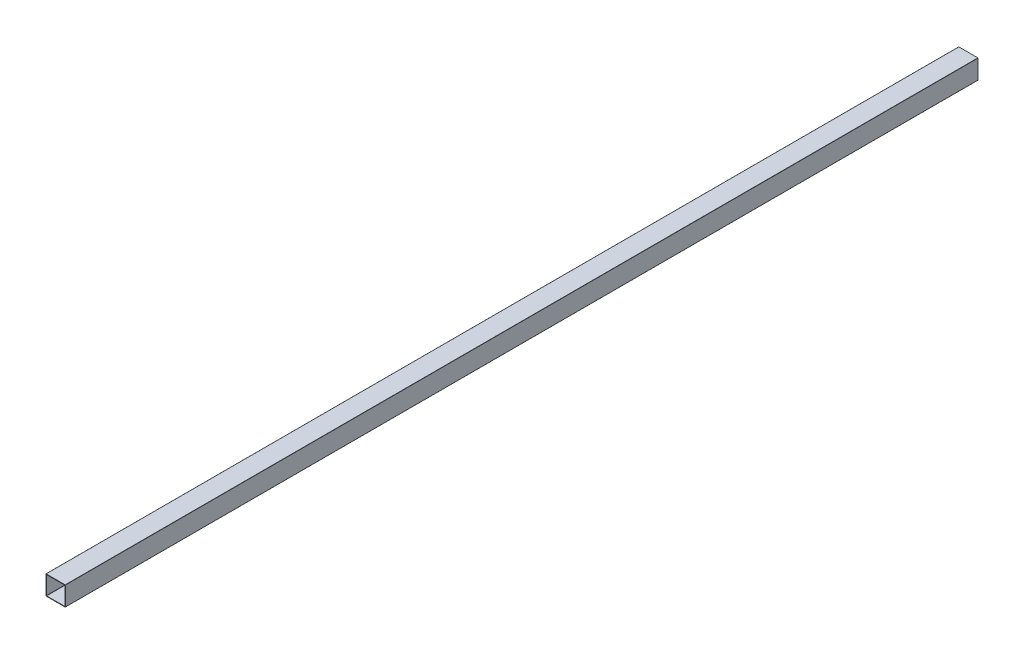
ISO-10303-21;
HEADER;
FILE_DESCRIPTION(('STEP AP214'),'2;1');
FILE_NAME('part.step','',(''),(''),'','','');
FILE_SCHEMA(('AUTOMOTIVE_DESIGN { 1 0 10303 214 1 1 1 1 }'));
ENDSEC;
DATA;
#1=APPLICATION_CONTEXT('core data for automotive mechanical design processes');
#2=APPLICATION_PROTOCOL_DEFINITION('international standard','automotive_design',2000,#1);
#3=PRODUCT_CONTEXT('',#1,'mechanical');
#4=PRODUCT('Part','Part','',(#3));
#5=PRODUCT_RELATED_PRODUCT_CATEGORY('part','',(#4));
#6=PRODUCT_DEFINITION_FORMATION('','',#4);
#7=PRODUCT_DEFINITION_CONTEXT('part definition',#1,'design');
#8=PRODUCT_DEFINITION('design','',#6,#7);
#9=PRODUCT_DEFINITION_SHAPE('','',#8);
#10=(LENGTH_UNIT() NAMED_UNIT(*) SI_UNIT(.MILLI.,.METRE.));
#11=(NAMED_UNIT(*) PLANE_ANGLE_UNIT() SI_UNIT($,.RADIAN.));
#12=(NAMED_UNIT(*) SI_UNIT($,.STERADIAN.) SOLID_ANGLE_UNIT());
#13=UNCERTAINTY_MEASURE_WITH_UNIT(LENGTH_MEASURE(1.E-05),#10,'distance_accuracy_value','');
#14=(GEOMETRIC_REPRESENTATION_CONTEXT(3) GLOBAL_UNCERTAINTY_ASSIGNED_CONTEXT((#13)) GLOBAL_UNIT_ASSIGNED_CONTEXT((#10,
#11,#12)) REPRESENTATION_CONTEXT('',''));
#15=CARTESIAN_POINT('',(0.,0.,0.));
#16=DIRECTION('',(0.,0.,1.));
#17=DIRECTION('',(1.,0.,0.));
#18=AXIS2_PLACEMENT_3D('',#15,#16,#17);
#19=CARTESIAN_POINT('',(63.5,-63.5,-6000.));
#20=DIRECTION('',(1.,0.,0.));
#21=DIRECTION('',(0.,0.,-1.));
#22=AXIS2_PLACEMENT_3D('',#19,#20,#21);
#23=PLANE('',#22);
#24=DIRECTION('',(0.,1.,0.));
#25=VECTOR('',#24,1.);
#26=CARTESIAN_POINT('',(63.5,-63.5,0.));
#27=LINE('',#26,#25);
#28=CARTESIAN_POINT('',(63.5,-62.5,0.));
#29=VERTEX_POINT('',#28);
#30=CARTESIAN_POINT('',(63.5,62.5,0.));
#31=VERTEX_POINT('',#30);
#32=EDGE_CURVE('E197',#29,#31,#27,.T.);
#33=ORIENTED_EDGE('',*,*,#32,.F.);
#34=DIRECTION('',(0.,0.,1.));
#35=VECTOR('',#34,1.);
#36=CARTESIAN_POINT('',(63.5,-62.5,-6000.));
#37=LINE('',#36,#35);
#38=CARTESIAN_POINT('',(63.5,-62.5,-6000.));
#39=VERTEX_POINT('',#38);
#40=EDGE_CURVE('E158',#29,#39,#37,.F.);
#41=ORIENTED_EDGE('',*,*,#40,.T.);
#42=DIRECTION('',(0.,1.,0.));
#43=VECTOR('',#42,1.);
#44=CARTESIAN_POINT('',(63.5,-63.5,-6000.));
#45=LINE('',#44,#43);
#46=CARTESIAN_POINT('',(63.5,62.5,-6000.));
#47=VERTEX_POINT('',#46);
#48=EDGE_CURVE('E185',#39,#47,#45,.T.);
#49=ORIENTED_EDGE('',*,*,#48,.T.);
#50=DIRECTION('',(0.,0.,1.));
#51=VECTOR('',#50,1.);
#52=CARTESIAN_POINT('',(63.5,62.5,-6000.));
#53=LINE('',#52,#51);
#54=EDGE_CURVE('E251',#47,#31,#53,.T.);
#55=ORIENTED_EDGE('',*,*,#54,.T.);
#56=EDGE_LOOP('',(#33,#41,#49,#55));
#57=FACE_BOUND('',#56,.T.);
#58=ADVANCED_FACE('F33',(#57),#23,.T.);
#59=CARTESIAN_POINT('',(-63.5,-63.5,-6000.));
#60=DIRECTION('',(0.,-1.,0.));
#61=DIRECTION('',(0.,0.,-1.));
#62=AXIS2_PLACEMENT_3D('',#59,#60,#61);
#63=PLANE('',#62);
#64=DIRECTION('',(1.,0.,0.));
#65=VECTOR('',#64,1.);
#66=CARTESIAN_POINT('',(-63.5,-63.5,0.));
#67=LINE('',#66,#65);
#68=CARTESIAN_POINT('',(-62.5,-63.5,0.));
#69=VERTEX_POINT('',#68);
#70=CARTESIAN_POINT('',(62.5,-63.5,0.));
#71=VERTEX_POINT('',#70);
#72=EDGE_CURVE('E189',#69,#71,#67,.T.);
#73=ORIENTED_EDGE('',*,*,#72,.F.);
#74=DIRECTION('',(0.,0.,1.));
#75=VECTOR('',#74,1.);
#76=CARTESIAN_POINT('',(-62.5,-63.5,-6000.));
#77=LINE('',#76,#75);
#78=CARTESIAN_POINT('',(-62.5,-63.5,-6000.));
#79=VERTEX_POINT('',#78);
#80=EDGE_CURVE('E238',#69,#79,#77,.F.);
#81=ORIENTED_EDGE('',*,*,#80,.T.);
#82=DIRECTION('',(1.,0.,0.));
#83=VECTOR('',#82,1.);
#84=CARTESIAN_POINT('',(-63.5,-63.5,-6000.));
#85=LINE('',#84,#83);
#86=CARTESIAN_POINT('',(62.5,-63.5,-6000.));
#87=VERTEX_POINT('',#86);
#88=EDGE_CURVE('E194',#79,#87,#85,.T.);
#89=ORIENTED_EDGE('',*,*,#88,.T.);
#90=DIRECTION('',(0.,0.,1.));
#91=VECTOR('',#90,1.);
#92=CARTESIAN_POINT('',(62.5,-63.5,-6000.));
#93=LINE('',#92,#91);
#94=EDGE_CURVE('E235',#87,#71,#93,.T.);
#95=ORIENTED_EDGE('',*,*,#94,.T.);
#96=EDGE_LOOP('',(#73,#81,#89,#95));
#97=FACE_BOUND('',#96,.T.);
#98=ADVANCED_FACE('F305',(#97),#63,.T.);
#99=CARTESIAN_POINT('',(-63.5,-63.5,-6000.));
#100=DIRECTION('',(-1.,0.,0.));
#101=DIRECTION('',(0.,0.,1.));
#102=AXIS2_PLACEMENT_3D('',#99,#100,#101);
#103=PLANE('',#102);
#104=DIRECTION('',(0.,-1.,0.));
#105=VECTOR('',#104,1.);
#106=CARTESIAN_POINT('',(-63.5,-63.5,-6000.));
#107=LINE('',#106,#105);
#108=CARTESIAN_POINT('',(-63.5,62.5,-6000.));
#109=VERTEX_POINT('',#108);
#110=CARTESIAN_POINT('',(-63.5,-62.5,-6000.));
#111=VERTEX_POINT('',#110);
#112=EDGE_CURVE('E191',#109,#111,#107,.T.);
#113=ORIENTED_EDGE('',*,*,#112,.T.);
#114=DIRECTION('',(0.,0.,1.));
#115=VECTOR('',#114,1.);
#116=CARTESIAN_POINT('',(-63.5,-62.5,-6000.));
#117=LINE('',#116,#115);
#118=CARTESIAN_POINT('',(-63.5,-62.5,0.));
#119=VERTEX_POINT('',#118);
#120=EDGE_CURVE('E224',#111,#119,#117,.T.);
#121=ORIENTED_EDGE('',*,*,#120,.T.);
#122=DIRECTION('',(0.,-1.,0.));
#123=VECTOR('',#122,1.);
#124=CARTESIAN_POINT('',(-63.5,-63.5,0.));
#125=LINE('',#124,#123);
#126=CARTESIAN_POINT('',(-63.5,62.5,0.));
#127=VERTEX_POINT('',#126);
#128=EDGE_CURVE('E203',#127,#119,#125,.T.);
#129=ORIENTED_EDGE('',*,*,#128,.F.);
#130=DIRECTION('',(0.,0.,1.));
#131=VECTOR('',#130,1.);
#132=CARTESIAN_POINT('',(-63.5,62.5,-6000.));
#133=LINE('',#132,#131);
#134=EDGE_CURVE('E222',#127,#109,#133,.F.);
#135=ORIENTED_EDGE('',*,*,#134,.T.);
#136=EDGE_LOOP('',(#113,#121,#129,#135));
#137=FACE_BOUND('',#136,.T.);
#138=ADVANCED_FACE('F311',(#137),#103,.T.);
#139=CARTESIAN_POINT('',(-63.5,63.5,-6000.));
#140=DIRECTION('',(0.,1.,0.));
#141=DIRECTION('',(0.,0.,1.));
#142=AXIS2_PLACEMENT_3D('',#139,#140,#141);
#143=PLANE('',#142);
#144=DIRECTION('',(-1.,0.,0.));
#145=VECTOR('',#144,1.);
#146=CARTESIAN_POINT('',(-63.5,63.5,-6000.));
#147=LINE('',#146,#145);
#148=CARTESIAN_POINT('',(62.5,63.5,-6000.));
#149=VERTEX_POINT('',#148);
#150=CARTESIAN_POINT('',(-62.5,63.5,-6000.));
#151=VERTEX_POINT('',#150);
#152=EDGE_CURVE('E188',#149,#151,#147,.T.);
#153=ORIENTED_EDGE('',*,*,#152,.T.);
#154=DIRECTION('',(0.,0.,1.));
#155=VECTOR('',#154,1.);
#156=CARTESIAN_POINT('',(-62.5,63.5,-6000.));
#157=LINE('',#156,#155);
#158=CARTESIAN_POINT('',(-62.5,63.5,0.));
#159=VERTEX_POINT('',#158);
#160=EDGE_CURVE('E248',#151,#159,#157,.T.);
#161=ORIENTED_EDGE('',*,*,#160,.T.);
#162=DIRECTION('',(-1.,0.,0.));
#163=VECTOR('',#162,1.);
#164=CARTESIAN_POINT('',(-63.5,63.5,0.));
#165=LINE('',#164,#163);
#166=CARTESIAN_POINT('',(62.5,63.5,0.));
#167=VERTEX_POINT('',#166);
#168=EDGE_CURVE('E200',#167,#159,#165,.T.);
#169=ORIENTED_EDGE('',*,*,#168,.F.);
#170=DIRECTION('',(0.,0.,1.));
#171=VECTOR('',#170,1.);
#172=CARTESIAN_POINT('',(62.5,63.5,-6000.));
#173=LINE('',#172,#171);
#174=EDGE_CURVE('E55',#167,#149,#173,.F.);
#175=ORIENTED_EDGE('',*,*,#174,.T.);
#176=EDGE_LOOP('',(#153,#161,#169,#175));
#177=FACE_BOUND('',#176,.T.);
#178=ADVANCED_FACE('F316',(#177),#143,.T.);
#179=CARTESIAN_POINT('',(0.,0.,-6000.));
#180=DIRECTION('',(0.,0.,-1.));
#181=DIRECTION('',(-1.,0.,0.));
#182=AXIS2_PLACEMENT_3D('',#179,#180,#181);
#183=PLANE('',#182);
#184=DIRECTION('',(0.,-1.,0.));
#185=VECTOR('',#184,1.);
#186=CARTESIAN_POINT('',(-60.46,-60.46,-6000.));
#187=LINE('',#186,#185);
#188=CARTESIAN_POINT('',(-60.46,59.46,-6000.));
#189=VERTEX_POINT('',#188);
#190=CARTESIAN_POINT('',(-60.46,-59.46,-6000.));
#191=VERTEX_POINT('',#190);
#192=EDGE_CURVE('E167',#189,#191,#187,.T.);
#193=ORIENTED_EDGE('',*,*,#192,.T.);
#194=CARTESIAN_POINT('',(-59.46,-59.46,-6000.));
#195=DIRECTION('',(0.,0.,-1.));
#196=DIRECTION('',(-1.,0.,0.));
#197=AXIS2_PLACEMENT_3D('',#194,#195,#196);
#198=CIRCLE('',#197,1.);
#199=CARTESIAN_POINT('',(-59.46,-60.46,-6000.));
#200=VERTEX_POINT('',#199);
#201=EDGE_CURVE('E11',#191,#200,#198,.F.);
#202=ORIENTED_EDGE('',*,*,#201,.T.);
#203=DIRECTION('',(1.,0.,0.));
#204=VECTOR('',#203,1.);
#205=CARTESIAN_POINT('',(-60.46,-60.46,-6000.));
#206=LINE('',#205,#204);
#207=CARTESIAN_POINT('',(59.46,-60.46,-6000.));
#208=VERTEX_POINT('',#207);
#209=EDGE_CURVE('E175',#200,#208,#206,.T.);
#210=ORIENTED_EDGE('',*,*,#209,.T.);
#211=CARTESIAN_POINT('',(59.46,-59.46,-6000.));
#212=DIRECTION('',(0.,0.,-1.));
#213=DIRECTION('',(-1.,0.,0.));
#214=AXIS2_PLACEMENT_3D('',#211,#212,#213);
#215=CIRCLE('',#214,1.);
#216=CARTESIAN_POINT('',(60.46,-59.46,-6000.));
#217=VERTEX_POINT('',#216);
#218=EDGE_CURVE('E262',#208,#217,#215,.F.);
#219=ORIENTED_EDGE('',*,*,#218,.T.);
#220=DIRECTION('',(0.,1.,0.));
#221=VECTOR('',#220,1.);
#222=CARTESIAN_POINT('',(60.46,-60.46,-6000.));
#223=LINE('',#222,#221);
#224=CARTESIAN_POINT('',(60.46,59.46,-6000.));
#225=VERTEX_POINT('',#224);
#226=EDGE_CURVE('E179',#217,#225,#223,.T.);
#227=ORIENTED_EDGE('',*,*,#226,.T.);
#228=CARTESIAN_POINT('',(59.46,59.46,-6000.));
#229=DIRECTION('',(0.,0.,-1.));
#230=DIRECTION('',(-1.,0.,0.));
#231=AXIS2_PLACEMENT_3D('',#228,#229,#230);
#232=CIRCLE('',#231,1.);
#233=CARTESIAN_POINT('',(59.46,60.46,-6000.));
#234=VERTEX_POINT('',#233);
#235=EDGE_CURVE('E258',#225,#234,#232,.F.);
#236=ORIENTED_EDGE('',*,*,#235,.T.);
#237=DIRECTION('',(-1.,0.,0.));
#238=VECTOR('',#237,1.);
#239=CARTESIAN_POINT('',(-60.46,60.46,-6000.));
#240=LINE('',#239,#238);
#241=CARTESIAN_POINT('',(-59.46,60.46,-6000.));
#242=VERTEX_POINT('',#241);
#243=EDGE_CURVE('E277',#234,#242,#240,.T.);
#244=ORIENTED_EDGE('',*,*,#243,.T.);
#245=CARTESIAN_POINT('',(-59.46,59.46,-6000.));
#246=DIRECTION('',(0.,0.,-1.));
#247=DIRECTION('',(-1.,0.,0.));
#248=AXIS2_PLACEMENT_3D('',#245,#246,#247);
#249=CIRCLE('',#248,1.);
#250=EDGE_CURVE('E157',#242,#189,#249,.F.);
#251=ORIENTED_EDGE('',*,*,#250,.T.);
#252=EDGE_LOOP('',(#193,#202,#210,#219,#227,#236,#244,#251));
#253=FACE_BOUND('',#252,.T.);
#254=ORIENTED_EDGE('',*,*,#88,.F.);
#255=CARTESIAN_POINT('',(-62.5,-62.5,-6000.));
#256=DIRECTION('',(0.,0.,-1.));
#257=DIRECTION('',(-1.,0.,0.));
#258=AXIS2_PLACEMENT_3D('',#255,#256,#257);
#259=CIRCLE('',#258,1.);
#260=EDGE_CURVE('E245',#79,#111,#259,.T.);
#261=ORIENTED_EDGE('',*,*,#260,.T.);
#262=ORIENTED_EDGE('',*,*,#112,.F.);
#263=CARTESIAN_POINT('',(-62.5,62.5,-6000.));
#264=DIRECTION('',(0.,0.,-1.));
#265=DIRECTION('',(-1.,0.,0.));
#266=AXIS2_PLACEMENT_3D('',#263,#264,#265);
#267=CIRCLE('',#266,1.);
#268=EDGE_CURVE('E48',#109,#151,#267,.T.);
#269=ORIENTED_EDGE('',*,*,#268,.T.);
#270=ORIENTED_EDGE('',*,*,#152,.F.);
#271=CARTESIAN_POINT('',(62.5,62.5,-6000.));
#272=DIRECTION('',(0.,0.,-1.));
#273=DIRECTION('',(-1.,0.,0.));
#274=AXIS2_PLACEMENT_3D('',#271,#272,#273);
#275=CIRCLE('',#274,1.);
#276=EDGE_CURVE('E240',#149,#47,#275,.T.);
#277=ORIENTED_EDGE('',*,*,#276,.T.);
#278=ORIENTED_EDGE('',*,*,#48,.F.);
#279=CARTESIAN_POINT('',(62.5,-62.5,-6000.));
#280=DIRECTION('',(0.,0.,-1.));
#281=DIRECTION('',(-1.,0.,0.));
#282=AXIS2_PLACEMENT_3D('',#279,#280,#281);
#283=CIRCLE('',#282,1.);
#284=EDGE_CURVE('E242',#39,#87,#283,.T.);
#285=ORIENTED_EDGE('',*,*,#284,.T.);
#286=EDGE_LOOP('',(#254,#261,#262,#269,#270,#277,#278,#285));
#287=FACE_BOUND('',#286,.T.);
#288=ADVANCED_FACE('F267',(#253,#287),#183,.T.);
#289=CARTESIAN_POINT('',(0.,0.,0.));
#290=DIRECTION('',(0.,0.,-1.));
#291=DIRECTION('',(-1.,0.,0.));
#292=AXIS2_PLACEMENT_3D('',#289,#290,#291);
#293=PLANE('',#292);
#294=DIRECTION('',(0.,1.,0.));
#295=VECTOR('',#294,1.);
#296=CARTESIAN_POINT('',(60.46,-60.46,0.));
#297=LINE('',#296,#295);
#298=CARTESIAN_POINT('',(60.46,-59.46,0.));
#299=VERTEX_POINT('',#298);
#300=CARTESIAN_POINT('',(60.46,59.46,0.));
#301=VERTEX_POINT('',#300);
#302=EDGE_CURVE('E181',#299,#301,#297,.T.);
#303=ORIENTED_EDGE('',*,*,#302,.F.);
#304=CARTESIAN_POINT('',(59.46,-59.46,0.));
#305=DIRECTION('',(0.,0.,-1.));
#306=DIRECTION('',(-1.,0.,0.));
#307=AXIS2_PLACEMENT_3D('',#304,#305,#306);
#308=CIRCLE('',#307,1.);
#309=CARTESIAN_POINT('',(59.46,-60.46,0.));
#310=VERTEX_POINT('',#309);
#311=EDGE_CURVE('E260',#299,#310,#308,.T.);
#312=ORIENTED_EDGE('',*,*,#311,.T.);
#313=DIRECTION('',(1.,0.,0.));
#314=VECTOR('',#313,1.);
#315=CARTESIAN_POINT('',(-60.46,-60.46,0.));
#316=LINE('',#315,#314);
#317=CARTESIAN_POINT('',(-59.46,-60.46,0.));
#318=VERTEX_POINT('',#317);
#319=EDGE_CURVE('E281',#318,#310,#316,.T.);
#320=ORIENTED_EDGE('',*,*,#319,.F.);
#321=CARTESIAN_POINT('',(-59.46,-59.46,0.));
#322=DIRECTION('',(0.,0.,-1.));
#323=DIRECTION('',(-1.,0.,0.));
#324=AXIS2_PLACEMENT_3D('',#321,#322,#323);
#325=CIRCLE('',#324,1.);
#326=CARTESIAN_POINT('',(-60.46,-59.46,0.));
#327=VERTEX_POINT('',#326);
#328=EDGE_CURVE('E41',#318,#327,#325,.T.);
#329=ORIENTED_EDGE('',*,*,#328,.T.);
#330=DIRECTION('',(0.,-1.,0.));
#331=VECTOR('',#330,1.);
#332=CARTESIAN_POINT('',(-60.46,-60.46,0.));
#333=LINE('',#332,#331);
#334=CARTESIAN_POINT('',(-60.46,59.46,0.));
#335=VERTEX_POINT('',#334);
#336=EDGE_CURVE('E164',#335,#327,#333,.T.);
#337=ORIENTED_EDGE('',*,*,#336,.F.);
#338=CARTESIAN_POINT('',(-59.46,59.46,0.));
#339=DIRECTION('',(0.,0.,-1.));
#340=DIRECTION('',(-1.,0.,0.));
#341=AXIS2_PLACEMENT_3D('',#338,#339,#340);
#342=CIRCLE('',#341,1.);
#343=CARTESIAN_POINT('',(-59.46,60.46,0.));
#344=VERTEX_POINT('',#343);
#345=EDGE_CURVE('E147',#335,#344,#342,.T.);
#346=ORIENTED_EDGE('',*,*,#345,.T.);
#347=DIRECTION('',(-1.,0.,0.));
#348=VECTOR('',#347,1.);
#349=CARTESIAN_POINT('',(-60.46,60.46,0.));
#350=LINE('',#349,#348);
#351=CARTESIAN_POINT('',(59.46,60.46,0.));
#352=VERTEX_POINT('',#351);
#353=EDGE_CURVE('E176',#352,#344,#350,.T.);
#354=ORIENTED_EDGE('',*,*,#353,.F.);
#355=CARTESIAN_POINT('',(59.46,59.46,0.));
#356=DIRECTION('',(0.,0.,-1.));
#357=DIRECTION('',(-1.,0.,0.));
#358=AXIS2_PLACEMENT_3D('',#355,#356,#357);
#359=CIRCLE('',#358,1.);
#360=EDGE_CURVE('E256',#352,#301,#359,.T.);
#361=ORIENTED_EDGE('',*,*,#360,.T.);
#362=EDGE_LOOP('',(#303,#312,#320,#329,#337,#346,#354,#361));
#363=FACE_BOUND('',#362,.T.);
#364=ORIENTED_EDGE('',*,*,#128,.T.);
#365=CARTESIAN_POINT('',(-62.5,-62.5,0.));
#366=DIRECTION('',(0.,0.,-1.));
#367=DIRECTION('',(-1.,0.,0.));
#368=AXIS2_PLACEMENT_3D('',#365,#366,#367);
#369=CIRCLE('',#368,1.);
#370=EDGE_CURVE('E233',#119,#69,#369,.F.);
#371=ORIENTED_EDGE('',*,*,#370,.T.);
#372=ORIENTED_EDGE('',*,*,#72,.T.);
#373=CARTESIAN_POINT('',(62.5,-62.5,0.));
#374=DIRECTION('',(0.,0.,-1.));
#375=DIRECTION('',(-1.,0.,0.));
#376=AXIS2_PLACEMENT_3D('',#373,#374,#375);
#377=CIRCLE('',#376,1.);
#378=EDGE_CURVE('E229',#71,#29,#377,.F.);
#379=ORIENTED_EDGE('',*,*,#378,.T.);
#380=ORIENTED_EDGE('',*,*,#32,.T.);
#381=CARTESIAN_POINT('',(62.5,62.5,0.));
#382=DIRECTION('',(0.,0.,-1.));
#383=DIRECTION('',(-1.,0.,0.));
#384=AXIS2_PLACEMENT_3D('',#381,#382,#383);
#385=CIRCLE('',#384,1.);
#386=EDGE_CURVE('E227',#31,#167,#385,.F.);
#387=ORIENTED_EDGE('',*,*,#386,.T.);
#388=ORIENTED_EDGE('',*,*,#168,.T.);
#389=CARTESIAN_POINT('',(-62.5,62.5,0.));
#390=DIRECTION('',(0.,0.,-1.));
#391=DIRECTION('',(-1.,0.,0.));
#392=AXIS2_PLACEMENT_3D('',#389,#390,#391);
#393=CIRCLE('',#392,1.);
#394=EDGE_CURVE('E231',#159,#127,#393,.F.);
#395=ORIENTED_EDGE('',*,*,#394,.T.);
#396=EDGE_LOOP('',(#364,#371,#372,#379,#380,#387,#388,#395));
#397=FACE_BOUND('',#396,.T.);
#398=ADVANCED_FACE('F172',(#363,#397),#293,.F.);
#399=CARTESIAN_POINT('',(-60.46,-60.46,-6000.));
#400=DIRECTION('',(0.,-1.,0.));
#401=DIRECTION('',(0.,0.,-1.));
#402=AXIS2_PLACEMENT_3D('',#399,#400,#401);
#403=PLANE('',#402);
#404=ORIENTED_EDGE('',*,*,#319,.T.);
#405=DIRECTION('',(0.,0.,1.));
#406=VECTOR('',#405,1.);
#407=CARTESIAN_POINT('',(59.46,-60.46,-6000.));
#408=LINE('',#407,#406);
#409=EDGE_CURVE('E220',#310,#208,#408,.F.);
#410=ORIENTED_EDGE('',*,*,#409,.T.);
#411=ORIENTED_EDGE('',*,*,#209,.F.);
#412=DIRECTION('',(0.,0.,1.));
#413=VECTOR('',#412,1.);
#414=CARTESIAN_POINT('',(-59.46,-60.46,0.));
#415=LINE('',#414,#413);
#416=EDGE_CURVE('E217',#200,#318,#415,.T.);
#417=ORIENTED_EDGE('',*,*,#416,.T.);
#418=EDGE_LOOP('',(#404,#410,#411,#417));
#419=FACE_BOUND('',#418,.T.);
#420=ADVANCED_FACE('F283',(#419),#403,.F.);
#421=CARTESIAN_POINT('',(-60.46,-60.46,-6000.));
#422=DIRECTION('',(-1.,0.,0.));
#423=DIRECTION('',(0.,0.,1.));
#424=AXIS2_PLACEMENT_3D('',#421,#422,#423);
#425=PLANE('',#424);
#426=ORIENTED_EDGE('',*,*,#192,.F.);
#427=DIRECTION('',(0.,0.,1.));
#428=VECTOR('',#427,1.);
#429=CARTESIAN_POINT('',(-60.46,59.46,0.));
#430=LINE('',#429,#428);
#431=EDGE_CURVE('E151',#189,#335,#430,.T.);
#432=ORIENTED_EDGE('',*,*,#431,.T.);
#433=ORIENTED_EDGE('',*,*,#336,.T.);
#434=DIRECTION('',(0.,0.,1.));
#435=VECTOR('',#434,1.);
#436=CARTESIAN_POINT('',(-60.46,-59.46,-6000.));
#437=LINE('',#436,#435);
#438=EDGE_CURVE('E169',#327,#191,#437,.F.);
#439=ORIENTED_EDGE('',*,*,#438,.T.);
#440=EDGE_LOOP('',(#426,#432,#433,#439));
#441=FACE_BOUND('',#440,.T.);
#442=ADVANCED_FACE('F163',(#441),#425,.F.);
#443=CARTESIAN_POINT('',(-60.46,60.46,-6000.));
#444=DIRECTION('',(0.,1.,0.));
#445=DIRECTION('',(0.,0.,1.));
#446=AXIS2_PLACEMENT_3D('',#443,#444,#445);
#447=PLANE('',#446);
#448=ORIENTED_EDGE('',*,*,#353,.T.);
#449=DIRECTION('',(0.,0.,1.));
#450=VECTOR('',#449,1.);
#451=CARTESIAN_POINT('',(-59.46,60.46,-6000.));
#452=LINE('',#451,#450);
#453=EDGE_CURVE('E152',#344,#242,#452,.F.);
#454=ORIENTED_EDGE('',*,*,#453,.T.);
#455=ORIENTED_EDGE('',*,*,#243,.F.);
#456=DIRECTION('',(0.,0.,1.));
#457=VECTOR('',#456,1.);
#458=CARTESIAN_POINT('',(59.46,60.46,0.));
#459=LINE('',#458,#457);
#460=EDGE_CURVE('E168',#234,#352,#459,.T.);
#461=ORIENTED_EDGE('',*,*,#460,.T.);
#462=EDGE_LOOP('',(#448,#454,#455,#461));
#463=FACE_BOUND('',#462,.T.);
#464=ADVANCED_FACE('F292',(#463),#447,.F.);
#465=CARTESIAN_POINT('',(60.46,-60.46,-6000.));
#466=DIRECTION('',(1.,0.,0.));
#467=DIRECTION('',(0.,0.,-1.));
#468=AXIS2_PLACEMENT_3D('',#465,#466,#467);
#469=PLANE('',#468);
#470=ORIENTED_EDGE('',*,*,#302,.T.);
#471=DIRECTION('',(0.,0.,1.));
#472=VECTOR('',#471,1.);
#473=CARTESIAN_POINT('',(60.46,59.46,-6000.));
#474=LINE('',#473,#472);
#475=EDGE_CURVE('E215',#301,#225,#474,.F.);
#476=ORIENTED_EDGE('',*,*,#475,.T.);
#477=ORIENTED_EDGE('',*,*,#226,.F.);
#478=DIRECTION('',(0.,0.,1.));
#479=VECTOR('',#478,1.);
#480=CARTESIAN_POINT('',(60.46,-59.46,0.));
#481=LINE('',#480,#479);
#482=EDGE_CURVE('E212',#217,#299,#481,.T.);
#483=ORIENTED_EDGE('',*,*,#482,.T.);
#484=EDGE_LOOP('',(#470,#476,#477,#483));
#485=FACE_BOUND('',#484,.T.);
#486=ADVANCED_FACE('F275',(#485),#469,.F.);
#487=CARTESIAN_POINT('',(-59.46,59.46,-6000.));
#488=DIRECTION('',(0.,0.,-1.));
#489=DIRECTION('',(-1.,0.,0.));
#490=AXIS2_PLACEMENT_3D('',#487,#488,#489);
#491=CYLINDRICAL_SURFACE('',#490,1.);
#492=ORIENTED_EDGE('',*,*,#250,.F.);
#493=ORIENTED_EDGE('',*,*,#453,.F.);
#494=ORIENTED_EDGE('',*,*,#345,.F.);
#495=ORIENTED_EDGE('',*,*,#431,.F.);
#496=EDGE_LOOP('',(#492,#493,#494,#495));
#497=FACE_BOUND('',#496,.T.);
#498=ADVANCED_FACE('F150',(#497),#491,.F.);
#499=CARTESIAN_POINT('',(59.46,59.46,-6000.));
#500=DIRECTION('',(0.,0.,-1.));
#501=DIRECTION('',(-1.,0.,0.));
#502=AXIS2_PLACEMENT_3D('',#499,#500,#501);
#503=CYLINDRICAL_SURFACE('',#502,1.);
#504=ORIENTED_EDGE('',*,*,#235,.F.);
#505=ORIENTED_EDGE('',*,*,#475,.F.);
#506=ORIENTED_EDGE('',*,*,#360,.F.);
#507=ORIENTED_EDGE('',*,*,#460,.F.);
#508=EDGE_LOOP('',(#504,#505,#506,#507));
#509=FACE_BOUND('',#508,.T.);
#510=ADVANCED_FACE('F294',(#509),#503,.F.);
#511=CARTESIAN_POINT('',(59.46,-59.46,-6000.));
#512=DIRECTION('',(0.,0.,-1.));
#513=DIRECTION('',(-1.,0.,0.));
#514=AXIS2_PLACEMENT_3D('',#511,#512,#513);
#515=CYLINDRICAL_SURFACE('',#514,1.);
#516=ORIENTED_EDGE('',*,*,#218,.F.);
#517=ORIENTED_EDGE('',*,*,#409,.F.);
#518=ORIENTED_EDGE('',*,*,#311,.F.);
#519=ORIENTED_EDGE('',*,*,#482,.F.);
#520=EDGE_LOOP('',(#516,#517,#518,#519));
#521=FACE_BOUND('',#520,.T.);
#522=ADVANCED_FACE('F279',(#521),#515,.F.);
#523=CARTESIAN_POINT('',(-62.5,-62.5,-6000.));
#524=DIRECTION('',(0.,0.,1.));
#525=DIRECTION('',(1.,0.,0.));
#526=AXIS2_PLACEMENT_3D('',#523,#524,#525);
#527=CYLINDRICAL_SURFACE('',#526,1.);
#528=ORIENTED_EDGE('',*,*,#260,.F.);
#529=ORIENTED_EDGE('',*,*,#80,.F.);
#530=ORIENTED_EDGE('',*,*,#370,.F.);
#531=ORIENTED_EDGE('',*,*,#120,.F.);
#532=EDGE_LOOP('',(#528,#529,#530,#531));
#533=FACE_BOUND('',#532,.T.);
#534=ADVANCED_FACE('F301',(#533),#527,.T.);
#535=CARTESIAN_POINT('',(-62.5,62.5,-6000.));
#536=DIRECTION('',(0.,0.,1.));
#537=DIRECTION('',(1.,0.,0.));
#538=AXIS2_PLACEMENT_3D('',#535,#536,#537);
#539=CYLINDRICAL_SURFACE('',#538,1.);
#540=ORIENTED_EDGE('',*,*,#268,.F.);
#541=ORIENTED_EDGE('',*,*,#134,.F.);
#542=ORIENTED_EDGE('',*,*,#394,.F.);
#543=ORIENTED_EDGE('',*,*,#160,.F.);
#544=EDGE_LOOP('',(#540,#541,#542,#543));
#545=FACE_BOUND('',#544,.T.);
#546=ADVANCED_FACE('F368',(#545),#539,.T.);
#547=CARTESIAN_POINT('',(-59.46,-59.46,-6000.));
#548=DIRECTION('',(0.,0.,-1.));
#549=DIRECTION('',(-1.,0.,0.));
#550=AXIS2_PLACEMENT_3D('',#547,#548,#549);
#551=CYLINDRICAL_SURFACE('',#550,1.);
#552=ORIENTED_EDGE('',*,*,#201,.F.);
#553=ORIENTED_EDGE('',*,*,#438,.F.);
#554=ORIENTED_EDGE('',*,*,#328,.F.);
#555=ORIENTED_EDGE('',*,*,#416,.F.);
#556=EDGE_LOOP('',(#552,#553,#554,#555));
#557=FACE_BOUND('',#556,.T.);
#558=ADVANCED_FACE('F378',(#557),#551,.F.);
#559=CARTESIAN_POINT('',(62.5,-62.5,-6000.));
#560=DIRECTION('',(0.,0.,1.));
#561=DIRECTION('',(1.,0.,0.));
#562=AXIS2_PLACEMENT_3D('',#559,#560,#561);
#563=CYLINDRICAL_SURFACE('',#562,1.);
#564=ORIENTED_EDGE('',*,*,#284,.F.);
#565=ORIENTED_EDGE('',*,*,#40,.F.);
#566=ORIENTED_EDGE('',*,*,#378,.F.);
#567=ORIENTED_EDGE('',*,*,#94,.F.);
#568=EDGE_LOOP('',(#564,#565,#566,#567));
#569=FACE_BOUND('',#568,.T.);
#570=ADVANCED_FACE('F388',(#569),#563,.T.);
#571=CARTESIAN_POINT('',(62.5,62.5,-6000.));
#572=DIRECTION('',(0.,0.,1.));
#573=DIRECTION('',(1.,0.,0.));
#574=AXIS2_PLACEMENT_3D('',#571,#572,#573);
#575=CYLINDRICAL_SURFACE('',#574,1.);
#576=ORIENTED_EDGE('',*,*,#276,.F.);
#577=ORIENTED_EDGE('',*,*,#174,.F.);
#578=ORIENTED_EDGE('',*,*,#386,.F.);
#579=ORIENTED_EDGE('',*,*,#54,.F.);
#580=EDGE_LOOP('',(#576,#577,#578,#579));
#581=FACE_BOUND('',#580,.T.);
#582=ADVANCED_FACE('F35',(#581),#575,.T.);
#583=CLOSED_SHELL('',(#58,#98,#138,#178,#288,#398,#420,#442,#464,#486,#498,#510,#522,#534,#546,
#558,#570,#582));
#584=MANIFOLD_SOLID_BREP('B2',#583);
#585=ADVANCED_BREP_SHAPE_REPRESENTATION('',(#18,#584),#14);
#586=SHAPE_DEFINITION_REPRESENTATION(#9,#585);
ENDSEC;
END-ISO-10303-21;
